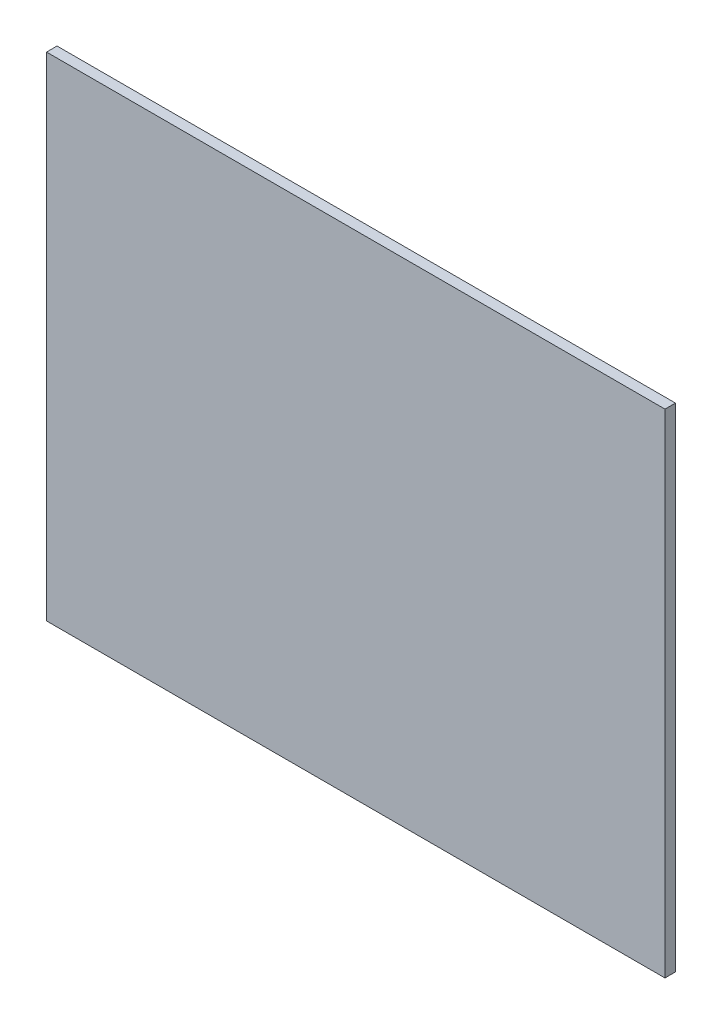
ISO-10303-21;
HEADER;
FILE_DESCRIPTION(('STEP AP214'),'2;1');
FILE_NAME('part.step','',(''),(''),'','','');
FILE_SCHEMA(('AUTOMOTIVE_DESIGN { 1 0 10303 214 1 1 1 1 }'));
ENDSEC;
DATA;
#1=APPLICATION_CONTEXT('core data for automotive mechanical design processes');
#2=APPLICATION_PROTOCOL_DEFINITION('international standard','automotive_design',2000,#1);
#3=PRODUCT_CONTEXT('',#1,'mechanical');
#4=PRODUCT('Part','Part','',(#3));
#5=PRODUCT_RELATED_PRODUCT_CATEGORY('part','',(#4));
#6=PRODUCT_DEFINITION_FORMATION('','',#4);
#7=PRODUCT_DEFINITION_CONTEXT('part definition',#1,'design');
#8=PRODUCT_DEFINITION('design','',#6,#7);
#9=PRODUCT_DEFINITION_SHAPE('','',#8);
#10=(LENGTH_UNIT() NAMED_UNIT(*) SI_UNIT(.MILLI.,.METRE.));
#11=(NAMED_UNIT(*) PLANE_ANGLE_UNIT() SI_UNIT($,.RADIAN.));
#12=(NAMED_UNIT(*) SI_UNIT($,.STERADIAN.) SOLID_ANGLE_UNIT());
#13=UNCERTAINTY_MEASURE_WITH_UNIT(LENGTH_MEASURE(1.E-05),#10,'distance_accuracy_value','');
#14=(GEOMETRIC_REPRESENTATION_CONTEXT(3) GLOBAL_UNCERTAINTY_ASSIGNED_CONTEXT((#13)) GLOBAL_UNIT_ASSIGNED_CONTEXT((#10,
#11,#12)) REPRESENTATION_CONTEXT('',''));
#15=CARTESIAN_POINT('',(0.,0.,0.));
#16=DIRECTION('',(0.,0.,1.));
#17=DIRECTION('',(1.,0.,0.));
#18=AXIS2_PLACEMENT_3D('',#15,#16,#17);
#19=CARTESIAN_POINT('',(0.,0.,5.));
#20=DIRECTION('',(-1.,0.,0.));
#21=DIRECTION('',(0.,0.,1.));
#22=AXIS2_PLACEMENT_3D('',#19,#20,#21);
#23=PLANE('',#22);
#24=DIRECTION('',(0.,1.,0.));
#25=VECTOR('',#24,1.);
#26=CARTESIAN_POINT('',(0.,0.,0.));
#27=LINE('',#26,#25);
#28=CARTESIAN_POINT('',(0.,-235.,0.));
#29=VERTEX_POINT('',#28);
#30=CARTESIAN_POINT('',(0.,0.,0.));
#31=VERTEX_POINT('',#30);
#32=EDGE_CURVE('E96',#29,#31,#27,.T.);
#33=ORIENTED_EDGE('',*,*,#32,.T.);
#34=DIRECTION('',(0.,0.,-1.));
#35=VECTOR('',#34,1.);
#36=CARTESIAN_POINT('',(0.,0.,5.));
#37=LINE('',#36,#35);
#38=CARTESIAN_POINT('',(0.,0.,5.));
#39=VERTEX_POINT('',#38);
#40=EDGE_CURVE('E11',#39,#31,#37,.T.);
#41=ORIENTED_EDGE('',*,*,#40,.F.);
#42=DIRECTION('',(0.,1.,0.));
#43=VECTOR('',#42,1.);
#44=CARTESIAN_POINT('',(0.,0.,5.));
#45=LINE('',#44,#43);
#46=CARTESIAN_POINT('',(0.,-235.,5.));
#47=VERTEX_POINT('',#46);
#48=EDGE_CURVE('E84',#47,#39,#45,.T.);
#49=ORIENTED_EDGE('',*,*,#48,.F.);
#50=DIRECTION('',(0.,0.,-1.));
#51=VECTOR('',#50,1.);
#52=CARTESIAN_POINT('',(0.,-235.,5.));
#53=LINE('',#52,#51);
#54=EDGE_CURVE('E92',#47,#29,#53,.T.);
#55=ORIENTED_EDGE('',*,*,#54,.T.);
#56=EDGE_LOOP('',(#33,#41,#49,#55));
#57=FACE_BOUND('',#56,.T.);
#58=ADVANCED_FACE('F33',(#57),#23,.F.);
#59=CARTESIAN_POINT('',(0.,0.,5.));
#60=DIRECTION('',(0.,-1.,0.));
#61=DIRECTION('',(0.,0.,-1.));
#62=AXIS2_PLACEMENT_3D('',#59,#60,#61);
#63=PLANE('',#62);
#64=DIRECTION('',(-1.,0.,0.));
#65=VECTOR('',#64,1.);
#66=CARTESIAN_POINT('',(0.,0.,0.));
#67=LINE('',#66,#65);
#68=CARTESIAN_POINT('',(-295.,0.,0.));
#69=VERTEX_POINT('',#68);
#70=EDGE_CURVE('E88',#31,#69,#67,.T.);
#71=ORIENTED_EDGE('',*,*,#70,.T.);
#72=DIRECTION('',(0.,0.,-1.));
#73=VECTOR('',#72,1.);
#74=CARTESIAN_POINT('',(-295.,0.,5.));
#75=LINE('',#74,#73);
#76=CARTESIAN_POINT('',(-295.,0.,5.));
#77=VERTEX_POINT('',#76);
#78=EDGE_CURVE('E41',#77,#69,#75,.T.);
#79=ORIENTED_EDGE('',*,*,#78,.F.);
#80=DIRECTION('',(-1.,0.,0.));
#81=VECTOR('',#80,1.);
#82=CARTESIAN_POINT('',(0.,0.,5.));
#83=LINE('',#82,#81);
#84=EDGE_CURVE('E79',#39,#77,#83,.T.);
#85=ORIENTED_EDGE('',*,*,#84,.F.);
#86=ORIENTED_EDGE('',*,*,#40,.T.);
#87=EDGE_LOOP('',(#71,#79,#85,#86));
#88=FACE_BOUND('',#87,.T.);
#89=ADVANCED_FACE('F87',(#88),#63,.F.);
#90=CARTESIAN_POINT('',(-295.,0.,5.));
#91=DIRECTION('',(1.,0.,0.));
#92=DIRECTION('',(0.,0.,-1.));
#93=AXIS2_PLACEMENT_3D('',#90,#91,#92);
#94=PLANE('',#93);
#95=DIRECTION('',(0.,-1.,0.));
#96=VECTOR('',#95,1.);
#97=CARTESIAN_POINT('',(-295.,0.,0.));
#98=LINE('',#97,#96);
#99=CARTESIAN_POINT('',(-295.,-235.,0.));
#100=VERTEX_POINT('',#99);
#101=EDGE_CURVE('E66',#69,#100,#98,.T.);
#102=ORIENTED_EDGE('',*,*,#101,.T.);
#103=DIRECTION('',(0.,0.,-1.));
#104=VECTOR('',#103,1.);
#105=CARTESIAN_POINT('',(-295.,-235.,5.));
#106=LINE('',#105,#104);
#107=CARTESIAN_POINT('',(-295.,-235.,5.));
#108=VERTEX_POINT('',#107);
#109=EDGE_CURVE('E89',#108,#100,#106,.T.);
#110=ORIENTED_EDGE('',*,*,#109,.F.);
#111=DIRECTION('',(0.,-1.,0.));
#112=VECTOR('',#111,1.);
#113=CARTESIAN_POINT('',(-295.,0.,5.));
#114=LINE('',#113,#112);
#115=EDGE_CURVE('E82',#77,#108,#114,.T.);
#116=ORIENTED_EDGE('',*,*,#115,.F.);
#117=ORIENTED_EDGE('',*,*,#78,.T.);
#118=EDGE_LOOP('',(#102,#110,#116,#117));
#119=FACE_BOUND('',#118,.T.);
#120=ADVANCED_FACE('F90',(#119),#94,.F.);
#121=CARTESIAN_POINT('',(0.,-235.,5.));
#122=DIRECTION('',(0.,1.,0.));
#123=DIRECTION('',(0.,0.,1.));
#124=AXIS2_PLACEMENT_3D('',#121,#122,#123);
#125=PLANE('',#124);
#126=DIRECTION('',(1.,0.,0.));
#127=VECTOR('',#126,1.);
#128=CARTESIAN_POINT('',(0.,-235.,0.));
#129=LINE('',#128,#127);
#130=EDGE_CURVE('E72',#100,#29,#129,.T.);
#131=ORIENTED_EDGE('',*,*,#130,.T.);
#132=ORIENTED_EDGE('',*,*,#54,.F.);
#133=DIRECTION('',(1.,0.,0.));
#134=VECTOR('',#133,1.);
#135=CARTESIAN_POINT('',(0.,-235.,5.));
#136=LINE('',#135,#134);
#137=EDGE_CURVE('E49',#108,#47,#136,.T.);
#138=ORIENTED_EDGE('',*,*,#137,.F.);
#139=ORIENTED_EDGE('',*,*,#109,.T.);
#140=EDGE_LOOP('',(#131,#132,#138,#139));
#141=FACE_BOUND('',#140,.T.);
#142=ADVANCED_FACE('F103',(#141),#125,.F.);
#143=CARTESIAN_POINT('',(0.,0.,5.));
#144=DIRECTION('',(0.,0.,-1.));
#145=DIRECTION('',(-1.,0.,0.));
#146=AXIS2_PLACEMENT_3D('',#143,#144,#145);
#147=PLANE('',#146);
#148=ORIENTED_EDGE('',*,*,#48,.T.);
#149=ORIENTED_EDGE('',*,*,#84,.T.);
#150=ORIENTED_EDGE('',*,*,#115,.T.);
#151=ORIENTED_EDGE('',*,*,#137,.T.);
#152=EDGE_LOOP('',(#148,#149,#150,#151));
#153=FACE_BOUND('',#152,.T.);
#154=ADVANCED_FACE('F80',(#153),#147,.F.);
#155=CARTESIAN_POINT('',(0.,0.,0.));
#156=DIRECTION('',(0.,0.,-1.));
#157=DIRECTION('',(-1.,0.,0.));
#158=AXIS2_PLACEMENT_3D('',#155,#156,#157);
#159=PLANE('',#158);
#160=ORIENTED_EDGE('',*,*,#32,.F.);
#161=ORIENTED_EDGE('',*,*,#130,.F.);
#162=ORIENTED_EDGE('',*,*,#101,.F.);
#163=ORIENTED_EDGE('',*,*,#70,.F.);
#164=EDGE_LOOP('',(#160,#161,#162,#163));
#165=FACE_BOUND('',#164,.T.);
#166=ADVANCED_FACE('F106',(#165),#159,.T.);
#167=CLOSED_SHELL('',(#58,#89,#120,#142,#154,#166));
#168=MANIFOLD_SOLID_BREP('B2',#167);
#169=ADVANCED_BREP_SHAPE_REPRESENTATION('',(#18,#168),#14);
#170=SHAPE_DEFINITION_REPRESENTATION(#9,#169);
ENDSEC;
END-ISO-10303-21;
